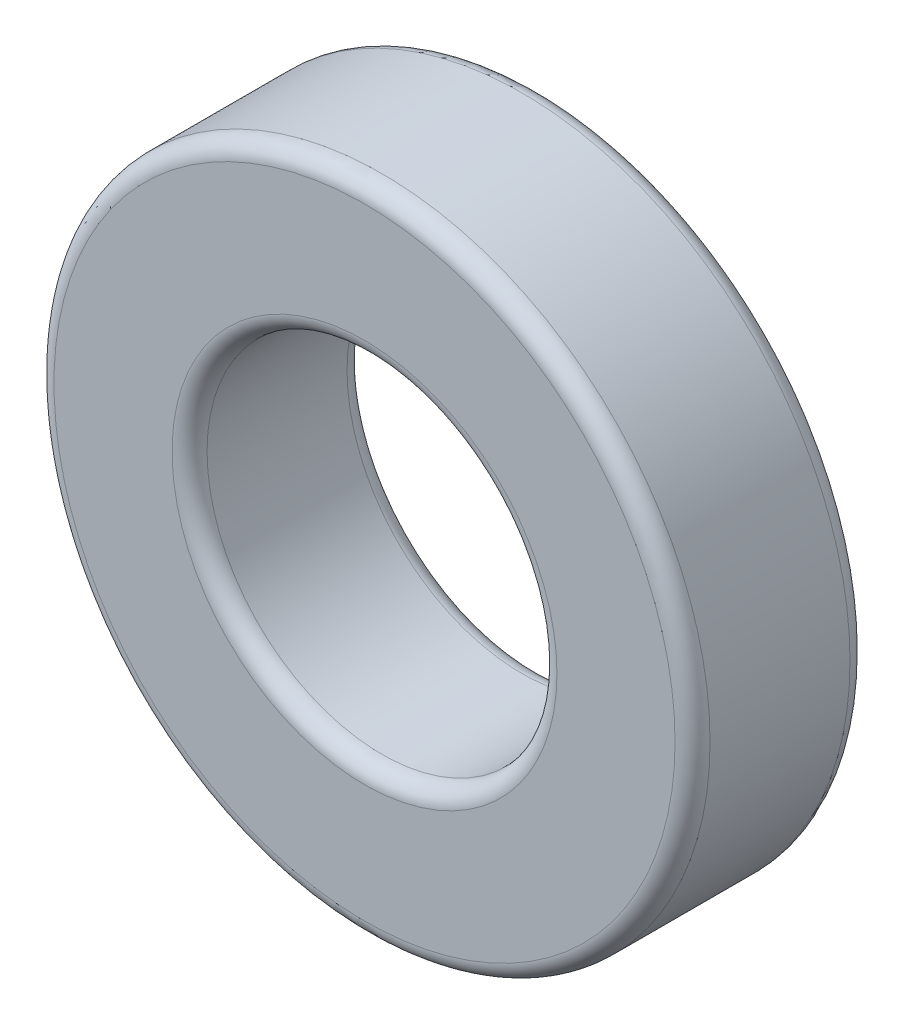
ISO-10303-21;
HEADER;
FILE_DESCRIPTION(('STEP AP214'),'2;1');
FILE_NAME('part.step','',(''),(''),'','','');
FILE_SCHEMA(('AUTOMOTIVE_DESIGN { 1 0 10303 214 1 1 1 1 }'));
ENDSEC;
DATA;
#1=APPLICATION_CONTEXT('core data for automotive mechanical design processes');
#2=APPLICATION_PROTOCOL_DEFINITION('international standard','automotive_design',2000,#1);
#3=PRODUCT_CONTEXT('',#1,'mechanical');
#4=PRODUCT('Part','Part','',(#3));
#5=PRODUCT_RELATED_PRODUCT_CATEGORY('part','',(#4));
#6=PRODUCT_DEFINITION_FORMATION('','',#4);
#7=PRODUCT_DEFINITION_CONTEXT('part definition',#1,'design');
#8=PRODUCT_DEFINITION('design','',#6,#7);
#9=PRODUCT_DEFINITION_SHAPE('','',#8);
#10=(LENGTH_UNIT() NAMED_UNIT(*) SI_UNIT(.MILLI.,.METRE.));
#11=(NAMED_UNIT(*) PLANE_ANGLE_UNIT() SI_UNIT($,.RADIAN.));
#12=(NAMED_UNIT(*) SI_UNIT($,.STERADIAN.) SOLID_ANGLE_UNIT());
#13=UNCERTAINTY_MEASURE_WITH_UNIT(LENGTH_MEASURE(1.E-05),#10,'distance_accuracy_value','');
#14=(GEOMETRIC_REPRESENTATION_CONTEXT(3) GLOBAL_UNCERTAINTY_ASSIGNED_CONTEXT((#13)) GLOBAL_UNIT_ASSIGNED_CONTEXT((#10,
#11,#12)) REPRESENTATION_CONTEXT('',''));
#15=CARTESIAN_POINT('',(0.,0.,0.));
#16=DIRECTION('',(0.,0.,1.));
#17=DIRECTION('',(1.,0.,0.));
#18=AXIS2_PLACEMENT_3D('',#15,#16,#17);
#19=CARTESIAN_POINT('',(0.,0.,0.5));
#20=DIRECTION('',(0.,0.,1.));
#21=DIRECTION('',(1.,0.,0.));
#22=AXIS2_PLACEMENT_3D('',#19,#20,#21);
#23=PLANE('',#22);
#24=CARTESIAN_POINT('',(0.,0.,0.5));
#25=DIRECTION('',(0.,0.,1.));
#26=DIRECTION('',(1.,0.,0.));
#27=AXIS2_PLACEMENT_3D('',#24,#25,#26);
#28=CIRCLE('',#27,0.8875);
#29=CARTESIAN_POINT('',(0.8875,0.,0.5));
#30=VERTEX_POINT('',#29);
#31=EDGE_CURVE('E42',#30,#30,#28,.T.);
#32=ORIENTED_EDGE('',*,*,#31,.T.);
#33=EDGE_LOOP('',(#32));
#34=FACE_BOUND('',#33,.T.);
#35=CARTESIAN_POINT('',(0.,0.,0.5));
#36=DIRECTION('',(0.,0.,1.));
#37=DIRECTION('',(1.,0.,0.));
#38=AXIS2_PLACEMENT_3D('',#35,#36,#37);
#39=CIRCLE('',#38,0.55);
#40=CARTESIAN_POINT('',(0.55,0.,0.5));
#41=VERTEX_POINT('',#40);
#42=EDGE_CURVE('E46',#41,#41,#39,.F.);
#43=ORIENTED_EDGE('',*,*,#42,.T.);
#44=EDGE_LOOP('',(#43));
#45=FACE_BOUND('',#44,.T.);
#46=ADVANCED_FACE('F31',(#34,#45),#23,.T.);
#47=CARTESIAN_POINT('',(0.,0.,0.));
#48=DIRECTION('',(0.,0.,1.));
#49=DIRECTION('',(1.,0.,0.));
#50=AXIS2_PLACEMENT_3D('',#47,#48,#49);
#51=PLANE('',#50);
#52=CARTESIAN_POINT('',(0.,0.,0.));
#53=DIRECTION('',(0.,0.,1.));
#54=DIRECTION('',(1.,0.,0.));
#55=AXIS2_PLACEMENT_3D('',#52,#53,#54);
#56=CIRCLE('',#55,0.8875);
#57=CARTESIAN_POINT('',(0.8875,0.,0.));
#58=VERTEX_POINT('',#57);
#59=EDGE_CURVE('E51',#58,#58,#56,.F.);
#60=ORIENTED_EDGE('',*,*,#59,.T.);
#61=EDGE_LOOP('',(#60));
#62=FACE_BOUND('',#61,.T.);
#63=CARTESIAN_POINT('',(0.,0.,0.));
#64=DIRECTION('',(0.,0.,1.));
#65=DIRECTION('',(1.,0.,0.));
#66=AXIS2_PLACEMENT_3D('',#63,#64,#65);
#67=CIRCLE('',#66,0.55);
#68=CARTESIAN_POINT('',(0.55,0.,0.));
#69=VERTEX_POINT('',#68);
#70=EDGE_CURVE('E54',#69,#69,#67,.T.);
#71=ORIENTED_EDGE('',*,*,#70,.T.);
#72=EDGE_LOOP('',(#71));
#73=FACE_BOUND('',#72,.T.);
#74=ADVANCED_FACE('F76',(#62,#73),#51,.F.);
#75=CARTESIAN_POINT('',(0.,0.,0.5));
#76=DIRECTION('',(0.,0.,-1.));
#77=DIRECTION('',(-1.,0.,0.));
#78=AXIS2_PLACEMENT_3D('',#75,#76,#77);
#79=CYLINDRICAL_SURFACE('',#78,0.9375);
#80=CARTESIAN_POINT('',(0.,0.,0.05));
#81=DIRECTION('',(0.,0.,1.));
#82=DIRECTION('',(1.,0.,0.));
#83=AXIS2_PLACEMENT_3D('',#80,#81,#82);
#84=CIRCLE('',#83,0.9375);
#85=CARTESIAN_POINT('',(0.9375,0.,0.05));
#86=VERTEX_POINT('',#85);
#87=EDGE_CURVE('E57',#86,#86,#84,.T.);
#88=ORIENTED_EDGE('',*,*,#87,.T.);
#89=EDGE_LOOP('',(#88));
#90=FACE_BOUND('',#89,.T.);
#91=CARTESIAN_POINT('',(0.,0.,0.45));
#92=DIRECTION('',(0.,0.,1.));
#93=DIRECTION('',(1.,0.,0.));
#94=AXIS2_PLACEMENT_3D('',#91,#92,#93);
#95=CIRCLE('',#94,0.9375);
#96=CARTESIAN_POINT('',(0.9375,0.,0.45));
#97=VERTEX_POINT('',#96);
#98=EDGE_CURVE('E60',#97,#97,#95,.F.);
#99=ORIENTED_EDGE('',*,*,#98,.T.);
#100=EDGE_LOOP('',(#99));
#101=FACE_BOUND('',#100,.T.);
#102=ADVANCED_FACE('F64',(#90,#101),#79,.T.);
#103=CARTESIAN_POINT('',(0.,0.,0.5));
#104=DIRECTION('',(0.,0.,-1.));
#105=DIRECTION('',(-1.,0.,0.));
#106=AXIS2_PLACEMENT_3D('',#103,#104,#105);
#107=CYLINDRICAL_SURFACE('',#106,0.5);
#108=CARTESIAN_POINT('',(0.,0.,0.05));
#109=DIRECTION('',(0.,0.,1.));
#110=DIRECTION('',(1.,0.,0.));
#111=AXIS2_PLACEMENT_3D('',#108,#109,#110);
#112=CIRCLE('',#111,0.5);
#113=CARTESIAN_POINT('',(0.5,0.,0.05));
#114=VERTEX_POINT('',#113);
#115=EDGE_CURVE('E10',#114,#114,#112,.F.);
#116=ORIENTED_EDGE('',*,*,#115,.T.);
#117=EDGE_LOOP('',(#116));
#118=FACE_BOUND('',#117,.T.);
#119=CARTESIAN_POINT('',(0.,0.,0.45));
#120=DIRECTION('',(0.,0.,1.));
#121=DIRECTION('',(1.,0.,0.));
#122=AXIS2_PLACEMENT_3D('',#119,#120,#121);
#123=CIRCLE('',#122,0.5);
#124=CARTESIAN_POINT('',(0.5,0.,0.45));
#125=VERTEX_POINT('',#124);
#126=EDGE_CURVE('E38',#125,#125,#123,.T.);
#127=ORIENTED_EDGE('',*,*,#126,.T.);
#128=EDGE_LOOP('',(#127));
#129=FACE_BOUND('',#128,.T.);
#130=ADVANCED_FACE('F92',(#118,#129),#107,.F.);
#131=CARTESIAN_POINT('',(0.,0.,0.05));
#132=DIRECTION('',(0.,0.,1.));
#133=DIRECTION('',(1.,0.,0.));
#134=AXIS2_PLACEMENT_3D('',#131,#132,#133);
#135=TOROIDAL_SURFACE('',#134,0.8875,0.05);
#136=ORIENTED_EDGE('',*,*,#59,.F.);
#137=EDGE_LOOP('',(#136));
#138=FACE_BOUND('',#137,.T.);
#139=ORIENTED_EDGE('',*,*,#87,.F.);
#140=EDGE_LOOP('',(#139));
#141=FACE_BOUND('',#140,.T.);
#142=ADVANCED_FACE('F70',(#138,#141),#135,.T.);
#143=CARTESIAN_POINT('',(0.,0.,0.45));
#144=DIRECTION('',(0.,0.,1.));
#145=DIRECTION('',(1.,0.,0.));
#146=AXIS2_PLACEMENT_3D('',#143,#144,#145);
#147=TOROIDAL_SURFACE('',#146,0.8875,0.05);
#148=ORIENTED_EDGE('',*,*,#98,.F.);
#149=EDGE_LOOP('',(#148));
#150=FACE_BOUND('',#149,.T.);
#151=ORIENTED_EDGE('',*,*,#31,.F.);
#152=EDGE_LOOP('',(#151));
#153=FACE_BOUND('',#152,.T.);
#154=ADVANCED_FACE('F66',(#150,#153),#147,.T.);
#155=CARTESIAN_POINT('',(0.,0.,0.05));
#156=DIRECTION('',(0.,0.,1.));
#157=DIRECTION('',(1.,0.,0.));
#158=AXIS2_PLACEMENT_3D('',#155,#156,#157);
#159=TOROIDAL_SURFACE('',#158,0.55,0.05);
#160=ORIENTED_EDGE('',*,*,#115,.F.);
#161=EDGE_LOOP('',(#160));
#162=FACE_BOUND('',#161,.T.);
#163=ORIENTED_EDGE('',*,*,#70,.F.);
#164=EDGE_LOOP('',(#163));
#165=FACE_BOUND('',#164,.T.);
#166=ADVANCED_FACE('F69',(#162,#165),#159,.T.);
#167=CARTESIAN_POINT('',(0.,0.,0.45));
#168=DIRECTION('',(0.,0.,1.));
#169=DIRECTION('',(1.,0.,0.));
#170=AXIS2_PLACEMENT_3D('',#167,#168,#169);
#171=TOROIDAL_SURFACE('',#170,0.55,0.05);
#172=ORIENTED_EDGE('',*,*,#42,.F.);
#173=EDGE_LOOP('',(#172));
#174=FACE_BOUND('',#173,.T.);
#175=ORIENTED_EDGE('',*,*,#126,.F.);
#176=EDGE_LOOP('',(#175));
#177=FACE_BOUND('',#176,.T.);
#178=ADVANCED_FACE('F33',(#174,#177),#171,.T.);
#179=CLOSED_SHELL('',(#46,#74,#102,#130,#142,#154,#166,#178));
#180=MANIFOLD_SOLID_BREP('B2',#179);
#181=ADVANCED_BREP_SHAPE_REPRESENTATION('',(#18,#180),#14);
#182=SHAPE_DEFINITION_REPRESENTATION(#9,#181);
ENDSEC;
END-ISO-10303-21;
